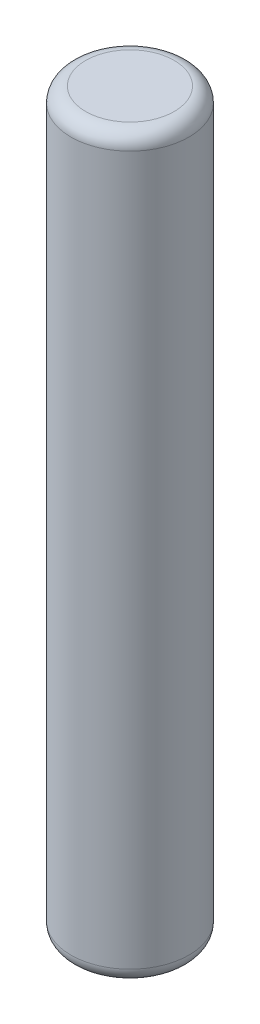
ISO-10303-21;
HEADER;
FILE_DESCRIPTION(('STEP AP214'),'2;1');
FILE_NAME('part.step','',(''),(''),'','','');
FILE_SCHEMA(('AUTOMOTIVE_DESIGN { 1 0 10303 214 1 1 1 1 }'));
ENDSEC;
DATA;
#1=APPLICATION_CONTEXT('core data for automotive mechanical design processes');
#2=APPLICATION_PROTOCOL_DEFINITION('international standard','automotive_design',2000,#1);
#3=PRODUCT_CONTEXT('',#1,'mechanical');
#4=PRODUCT('Part','Part','',(#3));
#5=PRODUCT_RELATED_PRODUCT_CATEGORY('part','',(#4));
#6=PRODUCT_DEFINITION_FORMATION('','',#4);
#7=PRODUCT_DEFINITION_CONTEXT('part definition',#1,'design');
#8=PRODUCT_DEFINITION('design','',#6,#7);
#9=PRODUCT_DEFINITION_SHAPE('','',#8);
#10=(LENGTH_UNIT() NAMED_UNIT(*) SI_UNIT(.MILLI.,.METRE.));
#11=(NAMED_UNIT(*) PLANE_ANGLE_UNIT() SI_UNIT($,.RADIAN.));
#12=(NAMED_UNIT(*) SI_UNIT($,.STERADIAN.) SOLID_ANGLE_UNIT());
#13=UNCERTAINTY_MEASURE_WITH_UNIT(LENGTH_MEASURE(1.E-05),#10,'distance_accuracy_value','');
#14=(GEOMETRIC_REPRESENTATION_CONTEXT(3) GLOBAL_UNCERTAINTY_ASSIGNED_CONTEXT((#13)) GLOBAL_UNIT_ASSIGNED_CONTEXT((#10,
#11,#12)) REPRESENTATION_CONTEXT('',''));
#15=CARTESIAN_POINT('',(0.,0.,0.));
#16=DIRECTION('',(0.,0.,1.));
#17=DIRECTION('',(1.,0.,0.));
#18=AXIS2_PLACEMENT_3D('',#15,#16,#17);
#19=CARTESIAN_POINT('',(0.,42.5,0.));
#20=DIRECTION('',(0.,-1.,0.));
#21=DIRECTION('',(0.,0.,-1.));
#22=AXIS2_PLACEMENT_3D('',#19,#20,#21);
#23=CYLINDRICAL_SURFACE('',#22,2.8);
#24=CARTESIAN_POINT('',(0.,8.2,0.));
#25=DIRECTION('',(0.,1.,0.));
#26=DIRECTION('',(0.,0.,1.));
#27=AXIS2_PLACEMENT_3D('',#24,#25,#26);
#28=CIRCLE('',#27,2.8);
#29=CARTESIAN_POINT('',(0.,8.2,2.8));
#30=VERTEX_POINT('',#29);
#31=EDGE_CURVE('E42',#30,#30,#28,.T.);
#32=ORIENTED_EDGE('',*,*,#31,.T.);
#33=EDGE_LOOP('',(#32));
#34=FACE_BOUND('',#33,.T.);
#35=CARTESIAN_POINT('',(0.,41.8,0.));
#36=DIRECTION('',(0.,1.,0.));
#37=DIRECTION('',(0.,0.,1.));
#38=AXIS2_PLACEMENT_3D('',#35,#36,#37);
#39=CIRCLE('',#38,2.8);
#40=CARTESIAN_POINT('',(0.,41.8,2.8));
#41=VERTEX_POINT('',#40);
#42=EDGE_CURVE('E46',#41,#41,#39,.F.);
#43=ORIENTED_EDGE('',*,*,#42,.T.);
#44=EDGE_LOOP('',(#43));
#45=FACE_BOUND('',#44,.T.);
#46=ADVANCED_FACE('F35',(#34,#45),#23,.T.);
#47=CARTESIAN_POINT('',(0.,42.5,0.));
#48=DIRECTION('',(0.,1.,0.));
#49=DIRECTION('',(0.,0.,1.));
#50=AXIS2_PLACEMENT_3D('',#47,#48,#49);
#51=PLANE('',#50);
#52=CARTESIAN_POINT('',(0.,42.5,0.));
#53=DIRECTION('',(0.,1.,0.));
#54=DIRECTION('',(0.,0.,1.));
#55=AXIS2_PLACEMENT_3D('',#52,#53,#54);
#56=CIRCLE('',#55,2.1);
#57=CARTESIAN_POINT('',(0.,42.5,2.1));
#58=VERTEX_POINT('',#57);
#59=EDGE_CURVE('E50',#58,#58,#56,.T.);
#60=ORIENTED_EDGE('',*,*,#59,.T.);
#61=EDGE_LOOP('',(#60));
#62=FACE_BOUND('',#61,.T.);
#63=ADVANCED_FACE('F56',(#62),#51,.T.);
#64=CARTESIAN_POINT('',(0.,7.5,0.));
#65=DIRECTION('',(0.,1.,0.));
#66=DIRECTION('',(0.,0.,1.));
#67=AXIS2_PLACEMENT_3D('',#64,#65,#66);
#68=PLANE('',#67);
#69=CARTESIAN_POINT('',(0.,7.5,0.));
#70=DIRECTION('',(0.,1.,0.));
#71=DIRECTION('',(0.,0.,1.));
#72=AXIS2_PLACEMENT_3D('',#69,#70,#71);
#73=CIRCLE('',#72,2.1);
#74=CARTESIAN_POINT('',(0.,7.5,2.1));
#75=VERTEX_POINT('',#74);
#76=EDGE_CURVE('E10',#75,#75,#73,.F.);
#77=ORIENTED_EDGE('',*,*,#76,.T.);
#78=EDGE_LOOP('',(#77));
#79=FACE_BOUND('',#78,.T.);
#80=ADVANCED_FACE('F60',(#79),#68,.F.);
#81=CARTESIAN_POINT('',(0.,41.8,0.));
#82=DIRECTION('',(0.,1.,0.));
#83=DIRECTION('',(0.,0.,1.));
#84=AXIS2_PLACEMENT_3D('',#81,#82,#83);
#85=TOROIDAL_SURFACE('',#84,2.1,0.7);
#86=ORIENTED_EDGE('',*,*,#42,.F.);
#87=EDGE_LOOP('',(#86));
#88=FACE_BOUND('',#87,.T.);
#89=ORIENTED_EDGE('',*,*,#59,.F.);
#90=EDGE_LOOP('',(#89));
#91=FACE_BOUND('',#90,.T.);
#92=ADVANCED_FACE('F58',(#88,#91),#85,.T.);
#93=CARTESIAN_POINT('',(0.,8.2,0.));
#94=DIRECTION('',(0.,1.,0.));
#95=DIRECTION('',(0.,0.,1.));
#96=AXIS2_PLACEMENT_3D('',#93,#94,#95);
#97=TOROIDAL_SURFACE('',#96,2.1,0.7);
#98=ORIENTED_EDGE('',*,*,#76,.F.);
#99=EDGE_LOOP('',(#98));
#100=FACE_BOUND('',#99,.T.);
#101=ORIENTED_EDGE('',*,*,#31,.F.);
#102=EDGE_LOOP('',(#101));
#103=FACE_BOUND('',#102,.T.);
#104=ADVANCED_FACE('F37',(#100,#103),#97,.T.);
#105=CLOSED_SHELL('',(#46,#63,#80,#92,#104));
#106=MANIFOLD_SOLID_BREP('B2',#105);
#107=ADVANCED_BREP_SHAPE_REPRESENTATION('',(#18,#106),#14);
#108=SHAPE_DEFINITION_REPRESENTATION(#9,#107);
ENDSEC;
END-ISO-10303-21;
